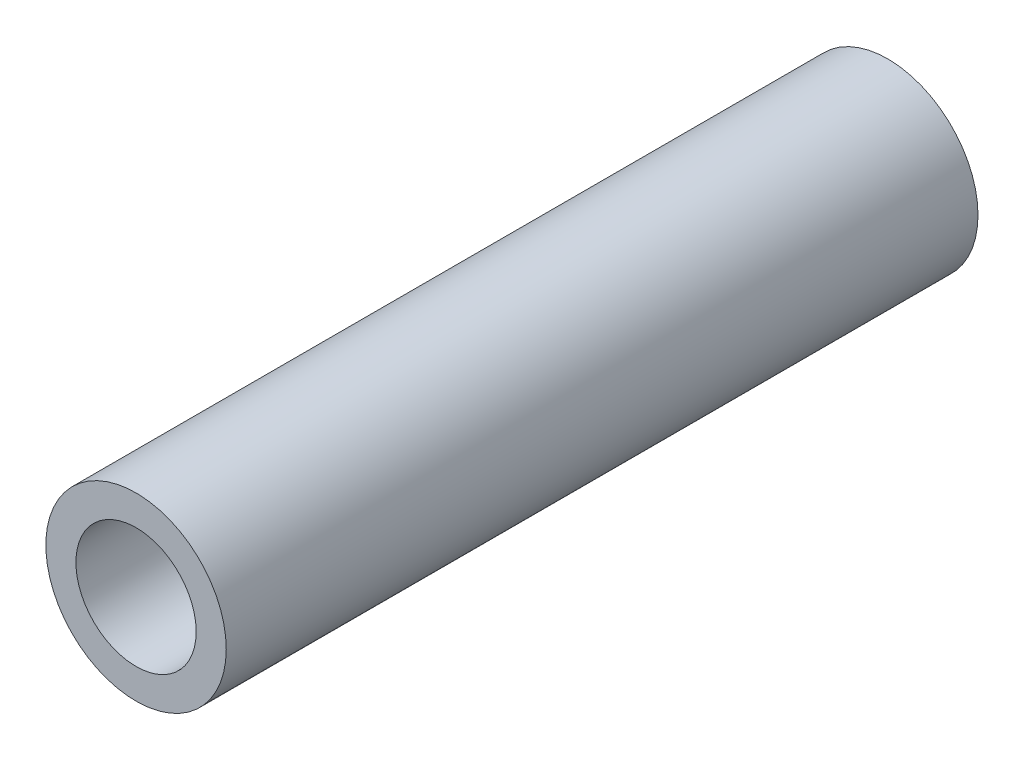
ISO-10303-21;
HEADER;
FILE_DESCRIPTION(('STEP AP214'),'2;1');
FILE_NAME('part.step','',(''),(''),'','','');
FILE_SCHEMA(('AUTOMOTIVE_DESIGN { 1 0 10303 214 1 1 1 1 }'));
ENDSEC;
DATA;
#1=APPLICATION_CONTEXT('core data for automotive mechanical design processes');
#2=APPLICATION_PROTOCOL_DEFINITION('international standard','automotive_design',2000,#1);
#3=PRODUCT_CONTEXT('',#1,'mechanical');
#4=PRODUCT('Part','Part','',(#3));
#5=PRODUCT_RELATED_PRODUCT_CATEGORY('part','',(#4));
#6=PRODUCT_DEFINITION_FORMATION('','',#4);
#7=PRODUCT_DEFINITION_CONTEXT('part definition',#1,'design');
#8=PRODUCT_DEFINITION('design','',#6,#7);
#9=PRODUCT_DEFINITION_SHAPE('','',#8);
#10=(LENGTH_UNIT() NAMED_UNIT(*) SI_UNIT(.MILLI.,.METRE.));
#11=(NAMED_UNIT(*) PLANE_ANGLE_UNIT() SI_UNIT($,.RADIAN.));
#12=(NAMED_UNIT(*) SI_UNIT($,.STERADIAN.) SOLID_ANGLE_UNIT());
#13=UNCERTAINTY_MEASURE_WITH_UNIT(LENGTH_MEASURE(1.E-05),#10,'distance_accuracy_value','');
#14=(GEOMETRIC_REPRESENTATION_CONTEXT(3) GLOBAL_UNCERTAINTY_ASSIGNED_CONTEXT((#13)) GLOBAL_UNIT_ASSIGNED_CONTEXT((#10,
#11,#12)) REPRESENTATION_CONTEXT('',''));
#15=CARTESIAN_POINT('',(0.,0.,0.));
#16=DIRECTION('',(0.,0.,1.));
#17=DIRECTION('',(1.,0.,0.));
#18=AXIS2_PLACEMENT_3D('',#15,#16,#17);
#19=CARTESIAN_POINT('',(0.,0.,25.));
#20=DIRECTION('',(0.,0.,1.));
#21=DIRECTION('',(1.,0.,0.));
#22=AXIS2_PLACEMENT_3D('',#19,#20,#21);
#23=PLANE('',#22);
#24=CARTESIAN_POINT('',(0.,0.,25.));
#25=DIRECTION('',(0.,0.,1.));
#26=DIRECTION('',(1.,0.,0.));
#27=AXIS2_PLACEMENT_3D('',#24,#25,#26);
#28=CIRCLE('',#27,3.);
#29=CARTESIAN_POINT('',(3.,0.,25.));
#30=VERTEX_POINT('',#29);
#31=EDGE_CURVE('E10',#30,#30,#28,.T.);
#32=ORIENTED_EDGE('',*,*,#31,.T.);
#33=EDGE_LOOP('',(#32));
#34=FACE_BOUND('',#33,.T.);
#35=CARTESIAN_POINT('',(0.,0.,25.));
#36=DIRECTION('',(0.,0.,1.));
#37=DIRECTION('',(1.,0.,0.));
#38=AXIS2_PLACEMENT_3D('',#35,#36,#37);
#39=CIRCLE('',#38,2.);
#40=CARTESIAN_POINT('',(2.,0.,25.));
#41=VERTEX_POINT('',#40);
#42=EDGE_CURVE('E46',#41,#41,#39,.T.);
#43=ORIENTED_EDGE('',*,*,#42,.F.);
#44=EDGE_LOOP('',(#43));
#45=FACE_BOUND('',#44,.T.);
#46=ADVANCED_FACE('F35',(#34,#45),#23,.T.);
#47=CARTESIAN_POINT('',(0.,0.,0.));
#48=DIRECTION('',(0.,0.,1.));
#49=DIRECTION('',(1.,0.,0.));
#50=AXIS2_PLACEMENT_3D('',#47,#48,#49);
#51=PLANE('',#50);
#52=CARTESIAN_POINT('',(0.,0.,0.));
#53=DIRECTION('',(0.,0.,1.));
#54=DIRECTION('',(1.,0.,0.));
#55=AXIS2_PLACEMENT_3D('',#52,#53,#54);
#56=CIRCLE('',#55,3.);
#57=CARTESIAN_POINT('',(3.,0.,0.));
#58=VERTEX_POINT('',#57);
#59=EDGE_CURVE('E39',#58,#58,#56,.T.);
#60=ORIENTED_EDGE('',*,*,#59,.F.);
#61=EDGE_LOOP('',(#60));
#62=FACE_BOUND('',#61,.T.);
#63=CARTESIAN_POINT('',(0.,0.,0.));
#64=DIRECTION('',(0.,0.,1.));
#65=DIRECTION('',(1.,0.,0.));
#66=AXIS2_PLACEMENT_3D('',#63,#64,#65);
#67=CIRCLE('',#66,2.);
#68=CARTESIAN_POINT('',(2.,0.,0.));
#69=VERTEX_POINT('',#68);
#70=EDGE_CURVE('E48',#69,#69,#67,.T.);
#71=ORIENTED_EDGE('',*,*,#70,.T.);
#72=EDGE_LOOP('',(#71));
#73=FACE_BOUND('',#72,.T.);
#74=ADVANCED_FACE('F58',(#62,#73),#51,.F.);
#75=CARTESIAN_POINT('',(0.,0.,25.));
#76=DIRECTION('',(0.,0.,-1.));
#77=DIRECTION('',(-1.,0.,0.));
#78=AXIS2_PLACEMENT_3D('',#75,#76,#77);
#79=CYLINDRICAL_SURFACE('',#78,3.);
#80=ORIENTED_EDGE('',*,*,#31,.F.);
#81=EDGE_LOOP('',(#80));
#82=FACE_BOUND('',#81,.T.);
#83=ORIENTED_EDGE('',*,*,#59,.T.);
#84=EDGE_LOOP('',(#83));
#85=FACE_BOUND('',#84,.T.);
#86=ADVANCED_FACE('F37',(#82,#85),#79,.T.);
#87=CARTESIAN_POINT('',(0.,0.,25.));
#88=DIRECTION('',(0.,0.,-1.));
#89=DIRECTION('',(-1.,0.,0.));
#90=AXIS2_PLACEMENT_3D('',#87,#88,#89);
#91=CYLINDRICAL_SURFACE('',#90,2.);
#92=ORIENTED_EDGE('',*,*,#42,.T.);
#93=EDGE_LOOP('',(#92));
#94=FACE_BOUND('',#93,.T.);
#95=ORIENTED_EDGE('',*,*,#70,.F.);
#96=EDGE_LOOP('',(#95));
#97=FACE_BOUND('',#96,.T.);
#98=ADVANCED_FACE('F54',(#94,#97),#91,.F.);
#99=CLOSED_SHELL('',(#46,#74,#86,#98));
#100=MANIFOLD_SOLID_BREP('B2',#99);
#101=ADVANCED_BREP_SHAPE_REPRESENTATION('',(#18,#100),#14);
#102=SHAPE_DEFINITION_REPRESENTATION(#9,#101);
ENDSEC;
END-ISO-10303-21;
